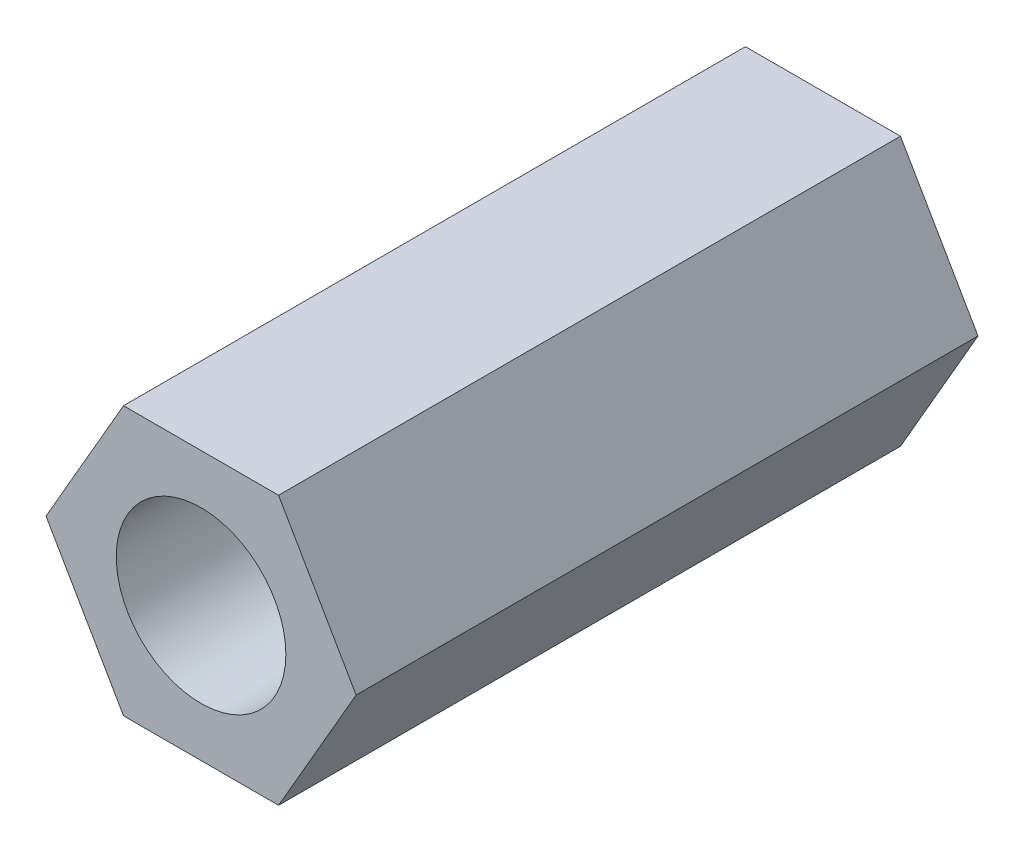
ISO-10303-21;
HEADER;
FILE_DESCRIPTION(('STEP AP214'),'2;1');
FILE_NAME('part.step','',(''),(''),'','','');
FILE_SCHEMA(('AUTOMOTIVE_DESIGN { 1 0 10303 214 1 1 1 1 }'));
ENDSEC;
DATA;
#1=APPLICATION_CONTEXT('core data for automotive mechanical design processes');
#2=APPLICATION_PROTOCOL_DEFINITION('international standard','automotive_design',2000,#1);
#3=PRODUCT_CONTEXT('',#1,'mechanical');
#4=PRODUCT('Part','Part','',(#3));
#5=PRODUCT_RELATED_PRODUCT_CATEGORY('part','',(#4));
#6=PRODUCT_DEFINITION_FORMATION('','',#4);
#7=PRODUCT_DEFINITION_CONTEXT('part definition',#1,'design');
#8=PRODUCT_DEFINITION('design','',#6,#7);
#9=PRODUCT_DEFINITION_SHAPE('','',#8);
#10=(LENGTH_UNIT() NAMED_UNIT(*) SI_UNIT(.MILLI.,.METRE.));
#11=(NAMED_UNIT(*) PLANE_ANGLE_UNIT() SI_UNIT($,.RADIAN.));
#12=(NAMED_UNIT(*) SI_UNIT($,.STERADIAN.) SOLID_ANGLE_UNIT());
#13=UNCERTAINTY_MEASURE_WITH_UNIT(LENGTH_MEASURE(1.E-05),#10,'distance_accuracy_value','');
#14=(GEOMETRIC_REPRESENTATION_CONTEXT(3) GLOBAL_UNCERTAINTY_ASSIGNED_CONTEXT((#13)) GLOBAL_UNIT_ASSIGNED_CONTEXT((#10,
#11,#12)) REPRESENTATION_CONTEXT('',''));
#15=CARTESIAN_POINT('',(0.,0.,0.));
#16=DIRECTION('',(0.,0.,1.));
#17=DIRECTION('',(1.,0.,0.));
#18=AXIS2_PLACEMENT_3D('',#15,#16,#17);
#19=CARTESIAN_POINT('',(0.90719827766866,1.5713135094611,0.));
#20=DIRECTION('',(0.,0.,1.));
#21=DIRECTION('',(1.,0.,0.));
#22=AXIS2_PLACEMENT_3D('',#19,#20,#21);
#23=CYLINDRICAL_SURFACE('',#22,1.5);
#24=CARTESIAN_POINT('',(0.90719827766866,1.5713135094611,0.));
#25=DIRECTION('',(0.,0.,1.));
#26=DIRECTION('',(1.,0.,0.));
#27=AXIS2_PLACEMENT_3D('',#24,#25,#26);
#28=CIRCLE('',#27,1.5);
#29=CARTESIAN_POINT('',(2.4071982776687,1.5713135094611,0.));
#30=VERTEX_POINT('',#29);
#31=EDGE_CURVE('E128',#30,#30,#28,.T.);
#32=ORIENTED_EDGE('',*,*,#31,.F.);
#33=DIRECTION('',(0.,0.,1.));
#34=VECTOR('',#33,1.);
#35=CARTESIAN_POINT('',(2.4071982776687,1.5713135094611,0.));
#36=LINE('',#35,#34);
#37=CARTESIAN_POINT('',(2.4071982776687,1.5713135094611,11.));
#38=VERTEX_POINT('',#37);
#39=EDGE_CURVE('E11',#30,#38,#36,.T.);
#40=ORIENTED_EDGE('',*,*,#39,.T.);
#41=CARTESIAN_POINT('',(0.90719827766866,1.5713135094611,11.));
#42=DIRECTION('',(0.,0.,-1.));
#43=DIRECTION('',(1.,0.,0.));
#44=AXIS2_PLACEMENT_3D('',#41,#42,#43);
#45=CIRCLE('',#44,1.5);
#46=EDGE_CURVE('E129',#38,#38,#45,.T.);
#47=ORIENTED_EDGE('',*,*,#46,.F.);
#48=ORIENTED_EDGE('',*,*,#39,.F.);
#49=EDGE_LOOP('',(#32,#40,#47,#48));
#50=FACE_BOUND('',#49,.T.);
#51=ADVANCED_FACE('F17',(#50),#23,.F.);
#52=CARTESIAN_POINT('',(2.9640086116567,0.3838135094611,5.5));
#53=DIRECTION('',(0.866025403784439,-0.5,0.));
#54=DIRECTION('',(0.,0.,-1.));
#55=AXIS2_PLACEMENT_3D('',#52,#53,#54);
#56=PLANE('',#55);
#57=DIRECTION('',(-0.500000000000011,-0.866025403784432,0.));
#58=VECTOR('',#57,1.);
#59=CARTESIAN_POINT('',(3.6496120563194,1.5713135094611,0.));
#60=LINE('',#59,#58);
#61=CARTESIAN_POINT('',(3.6496120563194,1.5713135094611,0.));
#62=VERTEX_POINT('',#61);
#63=CARTESIAN_POINT('',(2.278405166994,-0.8036864905389,0.));
#64=VERTEX_POINT('',#63);
#65=EDGE_CURVE('E173',#62,#64,#60,.T.);
#66=ORIENTED_EDGE('',*,*,#65,.F.);
#67=DIRECTION('',(0.,0.,-1.));
#68=VECTOR('',#67,1.);
#69=CARTESIAN_POINT('',(3.6496120563194,1.5713135094611,11.));
#70=LINE('',#69,#68);
#71=CARTESIAN_POINT('',(3.6496120563194,1.5713135094611,11.));
#72=VERTEX_POINT('',#71);
#73=EDGE_CURVE('E102',#72,#62,#70,.T.);
#74=ORIENTED_EDGE('',*,*,#73,.F.);
#75=DIRECTION('',(0.500000000000011,0.866025403784432,0.));
#76=VECTOR('',#75,1.);
#77=CARTESIAN_POINT('',(2.278405166994,-0.8036864905389,11.));
#78=LINE('',#77,#76);
#79=CARTESIAN_POINT('',(2.278405166994,-0.8036864905389,11.));
#80=VERTEX_POINT('',#79);
#81=EDGE_CURVE('E131',#80,#72,#78,.T.);
#82=ORIENTED_EDGE('',*,*,#81,.F.);
#83=DIRECTION('',(0.,0.,1.));
#84=VECTOR('',#83,1.);
#85=CARTESIAN_POINT('',(2.278405166994,-0.8036864905389,0.));
#86=LINE('',#85,#84);
#87=EDGE_CURVE('E27',#64,#80,#86,.T.);
#88=ORIENTED_EDGE('',*,*,#87,.F.);
#89=EDGE_LOOP('',(#66,#74,#82,#88));
#90=FACE_BOUND('',#89,.T.);
#91=ADVANCED_FACE('F19',(#90),#56,.T.);
#92=CARTESIAN_POINT('',(0.90719827766866,-0.8036864905389,5.5));
#93=DIRECTION('',(0.,-1.,0.));
#94=DIRECTION('',(0.,0.,-1.));
#95=AXIS2_PLACEMENT_3D('',#92,#93,#94);
#96=PLANE('',#95);
#97=DIRECTION('',(-1.,0.,0.));
#98=VECTOR('',#97,1.);
#99=CARTESIAN_POINT('',(2.278405166994,-0.8036864905389,0.));
#100=LINE('',#99,#98);
#101=CARTESIAN_POINT('',(-0.4640086116567,-0.80368649053891,0.));
#102=VERTEX_POINT('',#101);
#103=EDGE_CURVE('E124',#64,#102,#100,.T.);
#104=ORIENTED_EDGE('',*,*,#103,.F.);
#105=ORIENTED_EDGE('',*,*,#87,.T.);
#106=DIRECTION('',(1.,0.,0.));
#107=VECTOR('',#106,1.);
#108=CARTESIAN_POINT('',(-0.4640086116567,-0.80368649053891,11.));
#109=LINE('',#108,#107);
#110=CARTESIAN_POINT('',(-0.4640086116567,-0.80368649053891,11.));
#111=VERTEX_POINT('',#110);
#112=EDGE_CURVE('E144',#111,#80,#109,.T.);
#113=ORIENTED_EDGE('',*,*,#112,.F.);
#114=DIRECTION('',(0.,0.,1.));
#115=VECTOR('',#114,1.);
#116=CARTESIAN_POINT('',(-0.4640086116567,-0.80368649053891,0.));
#117=LINE('',#116,#115);
#118=EDGE_CURVE('E156',#102,#111,#117,.T.);
#119=ORIENTED_EDGE('',*,*,#118,.F.);
#120=EDGE_LOOP('',(#104,#105,#113,#119));
#121=FACE_BOUND('',#120,.T.);
#122=ADVANCED_FACE('F165',(#121),#96,.T.);
#123=CARTESIAN_POINT('',(-1.1496120563194,0.3838135094611,5.5));
#124=DIRECTION('',(-0.866025403784439,-0.5,0.));
#125=DIRECTION('',(-0.5,0.866025403784439,0.));
#126=AXIS2_PLACEMENT_3D('',#123,#124,#125);
#127=PLANE('',#126);
#128=DIRECTION('',(-0.500000000000011,0.866025403784432,0.));
#129=VECTOR('',#128,1.);
#130=CARTESIAN_POINT('',(-0.4640086116567,-0.80368649053891,0.));
#131=LINE('',#130,#129);
#132=CARTESIAN_POINT('',(-1.8352155009821,1.5713135094611,0.));
#133=VERTEX_POINT('',#132);
#134=EDGE_CURVE('E117',#102,#133,#131,.T.);
#135=ORIENTED_EDGE('',*,*,#134,.F.);
#136=ORIENTED_EDGE('',*,*,#118,.T.);
#137=DIRECTION('',(0.500000000000011,-0.866025403784432,0.));
#138=VECTOR('',#137,1.);
#139=CARTESIAN_POINT('',(-1.8352155009821,1.5713135094611,11.));
#140=LINE('',#139,#138);
#141=CARTESIAN_POINT('',(-1.8352155009821,1.5713135094611,11.));
#142=VERTEX_POINT('',#141);
#143=EDGE_CURVE('E138',#142,#111,#140,.T.);
#144=ORIENTED_EDGE('',*,*,#143,.F.);
#145=DIRECTION('',(0.,0.,1.));
#146=VECTOR('',#145,1.);
#147=CARTESIAN_POINT('',(-1.8352155009821,1.5713135094611,0.));
#148=LINE('',#147,#146);
#149=EDGE_CURVE('E66',#133,#142,#148,.T.);
#150=ORIENTED_EDGE('',*,*,#149,.F.);
#151=EDGE_LOOP('',(#135,#136,#144,#150));
#152=FACE_BOUND('',#151,.T.);
#153=ADVANCED_FACE('F172',(#152),#127,.T.);
#154=CARTESIAN_POINT('',(-1.1496120563194,2.7588135094611,5.5));
#155=DIRECTION('',(-0.866025403784439,0.5,0.));
#156=DIRECTION('',(0.,0.,1.));
#157=AXIS2_PLACEMENT_3D('',#154,#155,#156);
#158=PLANE('',#157);
#159=DIRECTION('',(0.500000000000011,0.866025403784432,0.));
#160=VECTOR('',#159,1.);
#161=CARTESIAN_POINT('',(-1.8352155009821,1.5713135094611,0.));
#162=LINE('',#161,#160);
#163=CARTESIAN_POINT('',(-0.4640086116567,3.9463135094611,0.));
#164=VERTEX_POINT('',#163);
#165=EDGE_CURVE('E96',#133,#164,#162,.T.);
#166=ORIENTED_EDGE('',*,*,#165,.F.);
#167=ORIENTED_EDGE('',*,*,#149,.T.);
#168=DIRECTION('',(-0.500000000000011,-0.866025403784432,0.));
#169=VECTOR('',#168,1.);
#170=CARTESIAN_POINT('',(-0.4640086116567,3.9463135094611,11.));
#171=LINE('',#170,#169);
#172=CARTESIAN_POINT('',(-0.4640086116567,3.9463135094611,11.));
#173=VERTEX_POINT('',#172);
#174=EDGE_CURVE('E99',#173,#142,#171,.T.);
#175=ORIENTED_EDGE('',*,*,#174,.F.);
#176=DIRECTION('',(0.,0.,1.));
#177=VECTOR('',#176,1.);
#178=CARTESIAN_POINT('',(-0.4640086116567,3.9463135094611,0.));
#179=LINE('',#178,#177);
#180=EDGE_CURVE('E81',#164,#173,#179,.T.);
#181=ORIENTED_EDGE('',*,*,#180,.F.);
#182=EDGE_LOOP('',(#166,#167,#175,#181));
#183=FACE_BOUND('',#182,.T.);
#184=ADVANCED_FACE('F94',(#183),#158,.T.);
#185=CARTESIAN_POINT('',(0.90719827766866,3.9463135094611,5.5));
#186=DIRECTION('',(0.,1.,0.));
#187=DIRECTION('',(1.,0.,0.));
#188=AXIS2_PLACEMENT_3D('',#185,#186,#187);
#189=PLANE('',#188);
#190=DIRECTION('',(1.,0.,0.));
#191=VECTOR('',#190,1.);
#192=CARTESIAN_POINT('',(-0.4640086116567,3.9463135094611,0.));
#193=LINE('',#192,#191);
#194=CARTESIAN_POINT('',(2.278405166994,3.9463135094611,0.));
#195=VERTEX_POINT('',#194);
#196=EDGE_CURVE('E105',#164,#195,#193,.T.);
#197=ORIENTED_EDGE('',*,*,#196,.F.);
#198=ORIENTED_EDGE('',*,*,#180,.T.);
#199=DIRECTION('',(-1.,0.,0.));
#200=VECTOR('',#199,1.);
#201=CARTESIAN_POINT('',(2.278405166994,3.9463135094611,11.));
#202=LINE('',#201,#200);
#203=CARTESIAN_POINT('',(2.278405166994,3.9463135094611,11.));
#204=VERTEX_POINT('',#203);
#205=EDGE_CURVE('E132',#204,#173,#202,.T.);
#206=ORIENTED_EDGE('',*,*,#205,.F.);
#207=DIRECTION('',(0.,0.,1.));
#208=VECTOR('',#207,1.);
#209=CARTESIAN_POINT('',(2.278405166994,3.9463135094611,0.));
#210=LINE('',#209,#208);
#211=EDGE_CURVE('E107',#195,#204,#210,.T.);
#212=ORIENTED_EDGE('',*,*,#211,.F.);
#213=EDGE_LOOP('',(#197,#198,#206,#212));
#214=FACE_BOUND('',#213,.T.);
#215=ADVANCED_FACE('F106',(#214),#189,.T.);
#216=CARTESIAN_POINT('',(2.9640086116567,2.7588135094611,5.5));
#217=DIRECTION('',(0.866025403784439,0.5,0.));
#218=DIRECTION('',(0.,0.,-1.));
#219=AXIS2_PLACEMENT_3D('',#216,#217,#218);
#220=PLANE('',#219);
#221=DIRECTION('',(0.500000000000011,-0.866025403784432,0.));
#222=VECTOR('',#221,1.);
#223=CARTESIAN_POINT('',(2.278405166994,3.9463135094611,0.));
#224=LINE('',#223,#222);
#225=EDGE_CURVE('E112',#195,#62,#224,.T.);
#226=ORIENTED_EDGE('',*,*,#225,.F.);
#227=ORIENTED_EDGE('',*,*,#211,.T.);
#228=DIRECTION('',(-0.500000000000011,0.866025403784432,0.));
#229=VECTOR('',#228,1.);
#230=CARTESIAN_POINT('',(3.6496120563194,1.5713135094611,11.));
#231=LINE('',#230,#229);
#232=EDGE_CURVE('E135',#72,#204,#231,.T.);
#233=ORIENTED_EDGE('',*,*,#232,.F.);
#234=ORIENTED_EDGE('',*,*,#73,.T.);
#235=EDGE_LOOP('',(#226,#227,#233,#234));
#236=FACE_BOUND('',#235,.T.);
#237=ADVANCED_FACE('F190',(#236),#220,.T.);
#238=CARTESIAN_POINT('',(0.90719827766866,1.9387272881118,11.));
#239=DIRECTION('',(0.,0.,1.));
#240=DIRECTION('',(1.,0.,0.));
#241=AXIS2_PLACEMENT_3D('',#238,#239,#240);
#242=PLANE('',#241);
#243=ORIENTED_EDGE('',*,*,#46,.T.);
#244=EDGE_LOOP('',(#243));
#245=FACE_BOUND('',#244,.T.);
#246=ORIENTED_EDGE('',*,*,#232,.T.);
#247=ORIENTED_EDGE('',*,*,#205,.T.);
#248=ORIENTED_EDGE('',*,*,#174,.T.);
#249=ORIENTED_EDGE('',*,*,#143,.T.);
#250=ORIENTED_EDGE('',*,*,#112,.T.);
#251=ORIENTED_EDGE('',*,*,#81,.T.);
#252=EDGE_LOOP('',(#246,#247,#248,#249,#250,#251));
#253=FACE_BOUND('',#252,.T.);
#254=ADVANCED_FACE('F171',(#245,#253),#242,.T.);
#255=CARTESIAN_POINT('',(0.90719827766866,1.9387272881118,0.));
#256=DIRECTION('',(0.,0.,-1.));
#257=DIRECTION('',(0.,-1.,0.));
#258=AXIS2_PLACEMENT_3D('',#255,#256,#257);
#259=PLANE('',#258);
#260=ORIENTED_EDGE('',*,*,#31,.T.);
#261=EDGE_LOOP('',(#260));
#262=FACE_BOUND('',#261,.T.);
#263=ORIENTED_EDGE('',*,*,#65,.T.);
#264=ORIENTED_EDGE('',*,*,#103,.T.);
#265=ORIENTED_EDGE('',*,*,#134,.T.);
#266=ORIENTED_EDGE('',*,*,#165,.T.);
#267=ORIENTED_EDGE('',*,*,#196,.T.);
#268=ORIENTED_EDGE('',*,*,#225,.T.);
#269=EDGE_LOOP('',(#263,#264,#265,#266,#267,#268));
#270=FACE_BOUND('',#269,.T.);
#271=ADVANCED_FACE('F115',(#262,#270),#259,.T.);
#272=CLOSED_SHELL('',(#51,#91,#122,#153,#184,#215,#237,#254,#271));
#273=MANIFOLD_SOLID_BREP('B1',#272);
#274=ADVANCED_BREP_SHAPE_REPRESENTATION('',(#18,#273),#14);
#275=SHAPE_DEFINITION_REPRESENTATION(#9,#274);
ENDSEC;
END-ISO-10303-21;
